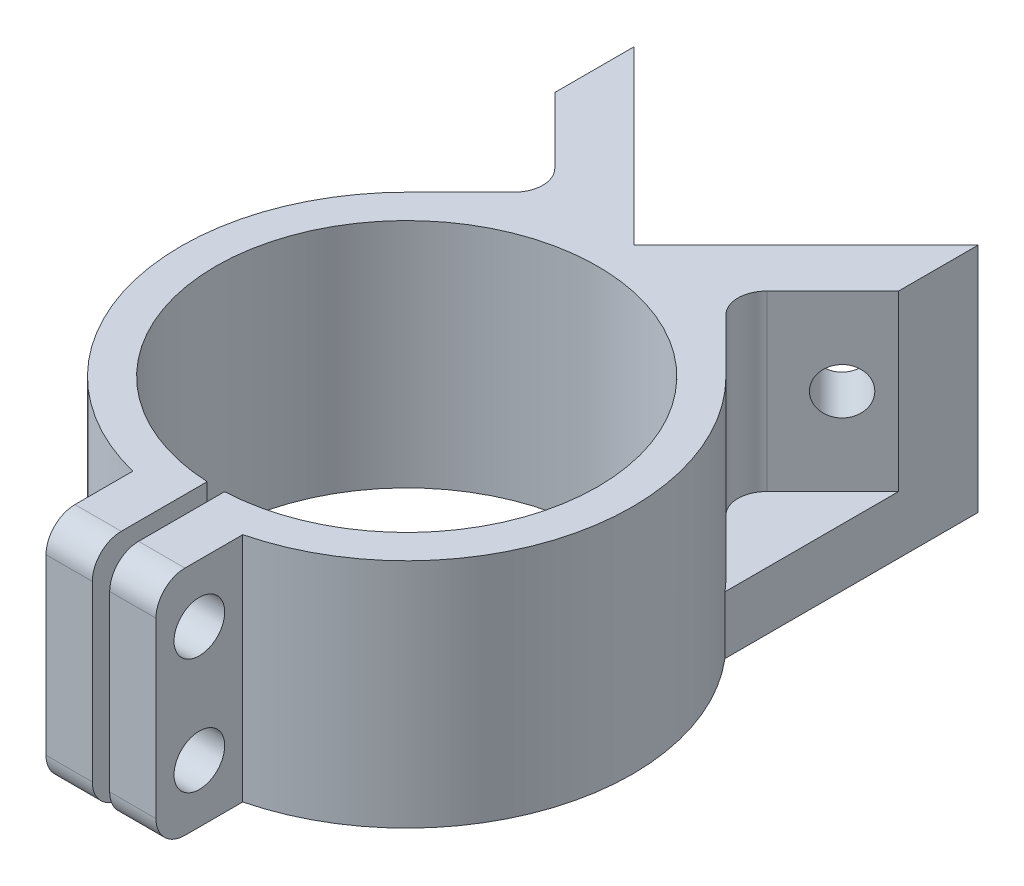
ISO-10303-21;
HEADER;
FILE_DESCRIPTION(('STEP AP214'),'2;1');
FILE_NAME('part.step','',(''),(''),'','','');
FILE_SCHEMA(('AUTOMOTIVE_DESIGN { 1 0 10303 214 1 1 1 1 }'));
ENDSEC;
DATA;
#1=APPLICATION_CONTEXT('core data for automotive mechanical design processes');
#2=APPLICATION_PROTOCOL_DEFINITION('international standard','automotive_design',2000,#1);
#3=PRODUCT_CONTEXT('',#1,'mechanical');
#4=PRODUCT('Part','Part','',(#3));
#5=PRODUCT_RELATED_PRODUCT_CATEGORY('part','',(#4));
#6=PRODUCT_DEFINITION_FORMATION('','',#4);
#7=PRODUCT_DEFINITION_CONTEXT('part definition',#1,'design');
#8=PRODUCT_DEFINITION('design','',#6,#7);
#9=PRODUCT_DEFINITION_SHAPE('','',#8);
#10=(LENGTH_UNIT() NAMED_UNIT(*) SI_UNIT(.MILLI.,.METRE.));
#11=(NAMED_UNIT(*) PLANE_ANGLE_UNIT() SI_UNIT($,.RADIAN.));
#12=(NAMED_UNIT(*) SI_UNIT($,.STERADIAN.) SOLID_ANGLE_UNIT());
#13=UNCERTAINTY_MEASURE_WITH_UNIT(LENGTH_MEASURE(1.E-05),#10,'distance_accuracy_value','');
#14=(GEOMETRIC_REPRESENTATION_CONTEXT(3) GLOBAL_UNCERTAINTY_ASSIGNED_CONTEXT((#13)) GLOBAL_UNIT_ASSIGNED_CONTEXT((#10,
#11,#12)) REPRESENTATION_CONTEXT('',''));
#15=CARTESIAN_POINT('',(0.,0.,0.));
#16=DIRECTION('',(0.,0.,1.));
#17=DIRECTION('',(1.,0.,0.));
#18=AXIS2_PLACEMENT_3D('',#15,#16,#17);
#19=CARTESIAN_POINT('',(1.50000000000001,40.,0.));
#20=DIRECTION('',(1.,0.,0.));
#21=DIRECTION('',(0.,0.,-1.));
#22=AXIS2_PLACEMENT_3D('',#19,#20,#21);
#23=PLANE('',#22);
#24=CARTESIAN_POINT('',(1.50000000000002,30.,45.3205737882841));
#25=DIRECTION('',(1.,0.,0.));
#26=DIRECTION('',(0.,0.,-1.));
#27=AXIS2_PLACEMENT_3D('',#24,#25,#26);
#28=CIRCLE('',#27,4.37500000000001);
#29=CARTESIAN_POINT('',(1.50000000000001,30.,40.9455737882841));
#30=VERTEX_POINT('',#29);
#31=EDGE_CURVE('E286',#30,#30,#28,.F.);
#32=ORIENTED_EDGE('',*,*,#31,.F.);
#33=EDGE_LOOP('',(#32));
#34=FACE_BOUND('',#33,.T.);
#35=DIRECTION('',(0.,0.,1.));
#36=VECTOR('',#35,1.);
#37=CARTESIAN_POINT('',(1.50000000000001,0.,0.));
#38=LINE('',#37,#36);
#39=CARTESIAN_POINT('',(1.50000000000001,0.,32.9658914637539));
#40=VERTEX_POINT('',#39);
#41=CARTESIAN_POINT('',(1.50000000000001,0.,47.8158914637539));
#42=VERTEX_POINT('',#41);
#43=EDGE_CURVE('E323',#40,#42,#38,.T.);
#44=ORIENTED_EDGE('',*,*,#43,.T.);
#45=CARTESIAN_POINT('',(1.50000000000001,5.,47.8158914637539));
#46=DIRECTION('',(1.,0.,0.));
#47=DIRECTION('',(0.,0.,-1.));
#48=AXIS2_PLACEMENT_3D('',#45,#46,#47);
#49=CIRCLE('',#48,5.);
#50=CARTESIAN_POINT('',(1.50000000000002,5.,52.8158914637539));
#51=VERTEX_POINT('',#50);
#52=EDGE_CURVE('E375',#42,#51,#49,.F.);
#53=ORIENTED_EDGE('',*,*,#52,.T.);
#54=DIRECTION('',(0.,-1.,0.));
#55=VECTOR('',#54,1.);
#56=CARTESIAN_POINT('',(1.50000000000002,40.,52.8158914637539));
#57=LINE('',#56,#55);
#58=CARTESIAN_POINT('',(1.50000000000002,35.,52.8158914637539));
#59=VERTEX_POINT('',#58);
#60=EDGE_CURVE('E347',#59,#51,#57,.T.);
#61=ORIENTED_EDGE('',*,*,#60,.F.);
#62=CARTESIAN_POINT('',(1.50000000000001,35.,47.8158914637539));
#63=DIRECTION('',(1.,0.,0.));
#64=DIRECTION('',(0.,0.,-1.));
#65=AXIS2_PLACEMENT_3D('',#62,#63,#64);
#66=CIRCLE('',#65,5.);
#67=CARTESIAN_POINT('',(1.50000000000001,40.,47.8158914637539));
#68=VERTEX_POINT('',#67);
#69=EDGE_CURVE('E50',#59,#68,#66,.F.);
#70=ORIENTED_EDGE('',*,*,#69,.T.);
#71=DIRECTION('',(0.,0.,1.));
#72=VECTOR('',#71,1.);
#73=CARTESIAN_POINT('',(1.50000000000001,40.,0.));
#74=LINE('',#73,#72);
#75=CARTESIAN_POINT('',(1.50000000000001,40.,32.9658914637539));
#76=VERTEX_POINT('',#75);
#77=EDGE_CURVE('E214',#76,#68,#74,.T.);
#78=ORIENTED_EDGE('',*,*,#77,.F.);
#79=DIRECTION('',(0.,-1.,0.));
#80=VECTOR('',#79,1.);
#81=CARTESIAN_POINT('',(1.50000000000001,40.,32.9658914637539));
#82=LINE('',#81,#80);
#83=EDGE_CURVE('E212',#76,#40,#82,.T.);
#84=ORIENTED_EDGE('',*,*,#83,.T.);
#85=EDGE_LOOP('',(#44,#53,#61,#70,#78,#84));
#86=FACE_BOUND('',#85,.T.);
#87=CARTESIAN_POINT('',(1.50000000000002,10.,45.3205737882841));
#88=DIRECTION('',(1.,0.,0.));
#89=DIRECTION('',(0.,0.,-1.));
#90=AXIS2_PLACEMENT_3D('',#87,#88,#89);
#91=CIRCLE('',#90,4.375);
#92=CARTESIAN_POINT('',(1.50000000000001,10.,40.9455737882841));
#93=VERTEX_POINT('',#92);
#94=EDGE_CURVE('E282',#93,#93,#91,.F.);
#95=ORIENTED_EDGE('',*,*,#94,.F.);
#96=EDGE_LOOP('',(#95));
#97=FACE_BOUND('',#96,.T.);
#98=ADVANCED_FACE('F35',(#34,#86,#97),#23,.F.);
#99=CARTESIAN_POINT('',(9.50000000000002,40.,0.));
#100=DIRECTION('',(-1.,0.,0.));
#101=DIRECTION('',(0.,0.,1.));
#102=AXIS2_PLACEMENT_3D('',#99,#100,#101);
#103=PLANE('',#102);
#104=CARTESIAN_POINT('',(9.50000000000002,30.,45.3205737882841));
#105=DIRECTION('',(-1.,0.,0.));
#106=DIRECTION('',(0.,0.,1.));
#107=AXIS2_PLACEMENT_3D('',#104,#105,#106);
#108=CIRCLE('',#107,4.37500000000001);
#109=CARTESIAN_POINT('',(9.50000000000002,30.,49.6955737882841));
#110=VERTEX_POINT('',#109);
#111=EDGE_CURVE('E285',#110,#110,#108,.F.);
#112=ORIENTED_EDGE('',*,*,#111,.F.);
#113=EDGE_LOOP('',(#112));
#114=FACE_BOUND('',#113,.T.);
#115=DIRECTION('',(0.,-1.,0.));
#116=VECTOR('',#115,1.);
#117=CARTESIAN_POINT('',(9.50000000000002,40.,52.8158914637539));
#118=LINE('',#117,#116);
#119=CARTESIAN_POINT('',(9.50000000000002,35.,52.8158914637539));
#120=VERTEX_POINT('',#119);
#121=CARTESIAN_POINT('',(9.50000000000002,5.,52.8158914637539));
#122=VERTEX_POINT('',#121);
#123=EDGE_CURVE('E344',#120,#122,#118,.T.);
#124=ORIENTED_EDGE('',*,*,#123,.T.);
#125=CARTESIAN_POINT('',(9.50000000000002,5.,47.8158914637539));
#126=DIRECTION('',(-1.,0.,0.));
#127=DIRECTION('',(0.,0.,1.));
#128=AXIS2_PLACEMENT_3D('',#125,#126,#127);
#129=CIRCLE('',#128,5.);
#130=CARTESIAN_POINT('',(9.50000000000002,0.,47.8158914637539));
#131=VERTEX_POINT('',#130);
#132=EDGE_CURVE('E371',#122,#131,#129,.F.);
#133=ORIENTED_EDGE('',*,*,#132,.T.);
#134=DIRECTION('',(0.,0.,-1.));
#135=VECTOR('',#134,1.);
#136=CARTESIAN_POINT('',(9.50000000000002,0.,0.));
#137=LINE('',#136,#135);
#138=CARTESIAN_POINT('',(9.50000000000002,0.,37.8252561128144));
#139=VERTEX_POINT('',#138);
#140=EDGE_CURVE('E325',#131,#139,#137,.T.);
#141=ORIENTED_EDGE('',*,*,#140,.T.);
#142=DIRECTION('',(0.,-1.,0.));
#143=VECTOR('',#142,1.);
#144=CARTESIAN_POINT('',(9.50000000000002,40.,37.8252561128144));
#145=LINE('',#144,#143);
#146=CARTESIAN_POINT('',(9.50000000000002,40.,37.8252561128144));
#147=VERTEX_POINT('',#146);
#148=EDGE_CURVE('E341',#147,#139,#145,.T.);
#149=ORIENTED_EDGE('',*,*,#148,.F.);
#150=DIRECTION('',(0.,0.,-1.));
#151=VECTOR('',#150,1.);
#152=CARTESIAN_POINT('',(9.50000000000002,40.,0.));
#153=LINE('',#152,#151);
#154=CARTESIAN_POINT('',(9.50000000000002,40.,47.8158914637539));
#155=VERTEX_POINT('',#154);
#156=EDGE_CURVE('E308',#155,#147,#153,.T.);
#157=ORIENTED_EDGE('',*,*,#156,.F.);
#158=CARTESIAN_POINT('',(9.50000000000002,35.,47.8158914637539));
#159=DIRECTION('',(-1.,0.,0.));
#160=DIRECTION('',(0.,0.,1.));
#161=AXIS2_PLACEMENT_3D('',#158,#159,#160);
#162=CIRCLE('',#161,5.);
#163=EDGE_CURVE('E369',#155,#120,#162,.F.);
#164=ORIENTED_EDGE('',*,*,#163,.T.);
#165=EDGE_LOOP('',(#124,#133,#141,#149,#157,#164));
#166=FACE_BOUND('',#165,.T.);
#167=CARTESIAN_POINT('',(9.50000000000002,10.,45.3205737882841));
#168=DIRECTION('',(-1.,0.,0.));
#169=DIRECTION('',(0.,0.,1.));
#170=AXIS2_PLACEMENT_3D('',#167,#168,#169);
#171=CIRCLE('',#170,4.375);
#172=CARTESIAN_POINT('',(9.50000000000002,10.,49.6955737882841));
#173=VERTEX_POINT('',#172);
#174=EDGE_CURVE('E281',#173,#173,#171,.F.);
#175=ORIENTED_EDGE('',*,*,#174,.F.);
#176=EDGE_LOOP('',(#175));
#177=FACE_BOUND('',#176,.T.);
#178=ADVANCED_FACE('F382',(#114,#166,#177),#103,.F.);
#179=CARTESIAN_POINT('',(0.,40.,0.));
#180=DIRECTION('',(0.,-1.,0.));
#181=DIRECTION('',(0.,0.,-1.));
#182=AXIS2_PLACEMENT_3D('',#179,#180,#181);
#183=CYLINDRICAL_SURFACE('',#182,39.);
#184=DIRECTION('',(0.,-1.,0.));
#185=VECTOR('',#184,1.);
#186=CARTESIAN_POINT('',(29.7000000000004,10.,-25.2766690843548));
#187=LINE('',#186,#185);
#188=CARTESIAN_POINT('',(29.7000000000004,9.99999999999999,-25.2766690843548));
#189=VERTEX_POINT('',#188);
#190=CARTESIAN_POINT('',(29.7000000000004,0.,-25.2766690843548));
#191=VERTEX_POINT('',#190);
#192=EDGE_CURVE('E303',#189,#191,#187,.T.);
#193=ORIENTED_EDGE('',*,*,#192,.F.);
#194=CARTESIAN_POINT('',(0.,10.,0.));
#195=DIRECTION('',(0.,1.,0.));
#196=DIRECTION('',(0.,0.,1.));
#197=AXIS2_PLACEMENT_3D('',#194,#195,#196);
#198=CIRCLE('',#197,39.);
#199=CARTESIAN_POINT('',(27.5771644662753,9.99999999999999,-27.5771644662754));
#200=VERTEX_POINT('',#199);
#201=EDGE_CURVE('E293',#189,#200,#198,.T.);
#202=ORIENTED_EDGE('',*,*,#201,.T.);
#203=DIRECTION('',(0.,-1.,0.));
#204=VECTOR('',#203,1.);
#205=CARTESIAN_POINT('',(27.5771644662753,40.,-27.5771644662754));
#206=LINE('',#205,#204);
#207=CARTESIAN_POINT('',(27.5771644662753,40.,-27.5771644662754));
#208=VERTEX_POINT('',#207);
#209=EDGE_CURVE('E338',#208,#200,#206,.T.);
#210=ORIENTED_EDGE('',*,*,#209,.F.);
#211=CARTESIAN_POINT('',(0.,40.,0.));
#212=DIRECTION('',(0.,1.,0.));
#213=DIRECTION('',(0.,0.,1.));
#214=AXIS2_PLACEMENT_3D('',#211,#212,#213);
#215=CIRCLE('',#214,39.);
#216=EDGE_CURVE('E310',#147,#208,#215,.T.);
#217=ORIENTED_EDGE('',*,*,#216,.F.);
#218=ORIENTED_EDGE('',*,*,#148,.T.);
#219=CARTESIAN_POINT('',(0.,0.,0.));
#220=DIRECTION('',(0.,1.,0.));
#221=DIRECTION('',(0.,0.,1.));
#222=AXIS2_PLACEMENT_3D('',#219,#220,#221);
#223=CIRCLE('',#222,39.);
#224=EDGE_CURVE('E327',#139,#191,#223,.T.);
#225=ORIENTED_EDGE('',*,*,#224,.T.);
#226=EDGE_LOOP('',(#193,#202,#210,#217,#218,#225));
#227=FACE_BOUND('',#226,.T.);
#228=ADVANCED_FACE('F389',(#227),#183,.T.);
#229=CARTESIAN_POINT('',(0.,40.,0.));
#230=DIRECTION('',(0.,-1.,0.));
#231=DIRECTION('',(0.,0.,-1.));
#232=AXIS2_PLACEMENT_3D('',#229,#230,#231);
#233=CYLINDRICAL_SURFACE('',#232,33.);
#234=CARTESIAN_POINT('',(0.,0.,0.));
#235=DIRECTION('',(0.,1.,0.));
#236=DIRECTION('',(0.,0.,1.));
#237=AXIS2_PLACEMENT_3D('',#234,#235,#236);
#238=CIRCLE('',#237,33.);
#239=CARTESIAN_POINT('',(-1.50000000000001,0.,32.9658914637539));
#240=VERTEX_POINT('',#239);
#241=EDGE_CURVE('E305',#240,#40,#238,.F.);
#242=ORIENTED_EDGE('',*,*,#241,.T.);
#243=ORIENTED_EDGE('',*,*,#83,.F.);
#244=CARTESIAN_POINT('',(0.,40.,0.));
#245=DIRECTION('',(0.,1.,0.));
#246=DIRECTION('',(0.,0.,1.));
#247=AXIS2_PLACEMENT_3D('',#244,#245,#246);
#248=CIRCLE('',#247,33.);
#249=CARTESIAN_POINT('',(-1.50000000000001,40.,32.9658914637539));
#250=VERTEX_POINT('',#249);
#251=EDGE_CURVE('E205',#250,#76,#248,.F.);
#252=ORIENTED_EDGE('',*,*,#251,.F.);
#253=DIRECTION('',(0.,-1.,0.));
#254=VECTOR('',#253,1.);
#255=CARTESIAN_POINT('',(-1.50000000000001,40.,32.9658914637539));
#256=LINE('',#255,#254);
#257=EDGE_CURVE('E209',#250,#240,#256,.T.);
#258=ORIENTED_EDGE('',*,*,#257,.T.);
#259=EDGE_LOOP('',(#242,#243,#252,#258));
#260=FACE_BOUND('',#259,.T.);
#261=ADVANCED_FACE('F207',(#260),#233,.F.);
#262=CARTESIAN_POINT('',(0.,40.,52.8158914637539));
#263=DIRECTION('',(0.,0.,-1.));
#264=DIRECTION('',(-1.,0.,0.));
#265=AXIS2_PLACEMENT_3D('',#262,#263,#264);
#266=PLANE('',#265);
#267=ORIENTED_EDGE('',*,*,#60,.T.);
#268=DIRECTION('',(1.,0.,0.));
#269=VECTOR('',#268,1.);
#270=CARTESIAN_POINT('',(0.,5.,52.8158914637539));
#271=LINE('',#270,#269);
#272=EDGE_CURVE('E366',#51,#122,#271,.T.);
#273=ORIENTED_EDGE('',*,*,#272,.T.);
#274=ORIENTED_EDGE('',*,*,#123,.F.);
#275=DIRECTION('',(1.,0.,0.));
#276=VECTOR('',#275,1.);
#277=CARTESIAN_POINT('',(1.50000000000002,35.,52.8158914637539));
#278=LINE('',#277,#276);
#279=EDGE_CURVE('E364',#120,#59,#278,.F.);
#280=ORIENTED_EDGE('',*,*,#279,.T.);
#281=EDGE_LOOP('',(#267,#273,#274,#280));
#282=FACE_BOUND('',#281,.T.);
#283=ADVANCED_FACE('F542',(#282),#266,.F.);
#284=CARTESIAN_POINT('',(27.5771644662753,40.,-27.5771644662754));
#285=DIRECTION('',(-0.707106781186546,0.,0.707106781186549));
#286=DIRECTION('',(0.707106781186549,0.,0.707106781186546));
#287=AXIS2_PLACEMENT_3D('',#284,#285,#286);
#288=PLANE('',#287);
#289=DIRECTION('',(-0.707106781186549,0.,-0.707106781186546));
#290=VECTOR('',#289,1.);
#291=CARTESIAN_POINT('',(27.5771644662753,10.,-27.5771644662754));
#292=LINE('',#291,#290);
#293=CARTESIAN_POINT('',(18.3216341497176,10.,-36.8326947828331));
#294=VERTEX_POINT('',#293);
#295=EDGE_CURVE('E300',#200,#294,#292,.T.);
#296=ORIENTED_EDGE('',*,*,#295,.T.);
#297=DIRECTION('',(0.,-1.,0.));
#298=VECTOR('',#297,1.);
#299=CARTESIAN_POINT('',(18.3216341497176,40.,-36.8326947828331));
#300=LINE('',#299,#298);
#301=CARTESIAN_POINT('',(18.3216341497176,40.,-36.8326947828331));
#302=VERTEX_POINT('',#301);
#303=EDGE_CURVE('E362',#294,#302,#300,.F.);
#304=ORIENTED_EDGE('',*,*,#303,.T.);
#305=DIRECTION('',(-0.707106781186549,0.,-0.707106781186546));
#306=VECTOR('',#305,1.);
#307=CARTESIAN_POINT('',(27.5771644662753,40.,-27.5771644662754));
#308=LINE('',#307,#306);
#309=EDGE_CURVE('E312',#208,#302,#308,.T.);
#310=ORIENTED_EDGE('',*,*,#309,.F.);
#311=ORIENTED_EDGE('',*,*,#209,.T.);
#312=EDGE_LOOP('',(#296,#304,#310,#311));
#313=FACE_BOUND('',#312,.T.);
#314=ADVANCED_FACE('F559',(#313),#288,.F.);
#315=CARTESIAN_POINT('',(-12.7910642224905,40.,-12.7910642224904));
#316=DIRECTION('',(-0.707106781186549,0.,-0.707106781186546));
#317=DIRECTION('',(-0.707106781186546,0.,0.707106781186549));
#318=AXIS2_PLACEMENT_3D('',#315,#316,#317);
#319=PLANE('',#318);
#320=CARTESIAN_POINT('',(24.8194480196478,25.,-50.4015764646288));
#321=DIRECTION('',(0.707106781186549,0.,0.707106781186546));
#322=DIRECTION('',(0.707106781186546,0.,-0.707106781186549));
#323=AXIS2_PLACEMENT_3D('',#320,#321,#322);
#324=CIRCLE('',#323,3.99999999999999);
#325=CARTESIAN_POINT('',(27.647875144394,25.,-53.230003589375));
#326=VERTEX_POINT('',#325);
#327=EDGE_CURVE('E289',#326,#326,#324,.T.);
#328=ORIENTED_EDGE('',*,*,#327,.F.);
#329=EDGE_LOOP('',(#328));
#330=FACE_BOUND('',#329,.T.);
#331=DIRECTION('',(0.707106781186546,0.,-0.707106781186549));
#332=VECTOR('',#331,1.);
#333=CARTESIAN_POINT('',(-12.7910642224905,40.,-12.7910642224904));
#334=LINE('',#333,#332);
#335=CARTESIAN_POINT('',(18.3216341497176,40.,-43.9037625946986));
#336=VERTEX_POINT('',#335);
#337=CARTESIAN_POINT('',(29.7000000000002,40.,-55.2821284449813));
#338=VERTEX_POINT('',#337);
#339=EDGE_CURVE('E315',#336,#338,#334,.T.);
#340=ORIENTED_EDGE('',*,*,#339,.F.);
#341=DIRECTION('',(0.,-1.,0.));
#342=VECTOR('',#341,1.);
#343=CARTESIAN_POINT('',(18.3216341497176,9.99999999999999,-43.9037625946986));
#344=LINE('',#343,#342);
#345=CARTESIAN_POINT('',(18.3216341497176,10.,-43.9037625946986));
#346=VERTEX_POINT('',#345);
#347=EDGE_CURVE('E351',#336,#346,#344,.T.);
#348=ORIENTED_EDGE('',*,*,#347,.T.);
#349=DIRECTION('',(0.707106781186546,0.,-0.707106781186549));
#350=VECTOR('',#349,1.);
#351=CARTESIAN_POINT('',(-12.7910642224905,10.,-12.7910642224904));
#352=LINE('',#351,#350);
#353=CARTESIAN_POINT('',(29.7000000000002,9.99999999999999,-55.2821284449813));
#354=VERTEX_POINT('',#353);
#355=EDGE_CURVE('E298',#346,#354,#352,.T.);
#356=ORIENTED_EDGE('',*,*,#355,.T.);
#357=DIRECTION('',(0.,-1.,0.));
#358=VECTOR('',#357,1.);
#359=CARTESIAN_POINT('',(29.7000000000002,40.,-55.2821284449813));
#360=LINE('',#359,#358);
#361=EDGE_CURVE('E335',#338,#354,#360,.T.);
#362=ORIENTED_EDGE('',*,*,#361,.F.);
#363=EDGE_LOOP('',(#340,#348,#356,#362));
#364=FACE_BOUND('',#363,.T.);
#365=ADVANCED_FACE('F400',(#330,#364),#319,.F.);
#366=CARTESIAN_POINT('',(29.7000000000002,40.,0.));
#367=DIRECTION('',(-1.,0.,0.));
#368=DIRECTION('',(0.,0.,1.));
#369=AXIS2_PLACEMENT_3D('',#366,#367,#368);
#370=PLANE('',#369);
#371=DIRECTION('',(0.,0.,-1.));
#372=VECTOR('',#371,1.);
#373=CARTESIAN_POINT('',(29.7000000000002,0.,0.));
#374=LINE('',#373,#372);
#375=CARTESIAN_POINT('',(29.7000000000002,0.,-69.0000000000003));
#376=VERTEX_POINT('',#375);
#377=EDGE_CURVE('E330',#191,#376,#374,.T.);
#378=ORIENTED_EDGE('',*,*,#377,.T.);
#379=DIRECTION('',(0.,-1.,0.));
#380=VECTOR('',#379,1.);
#381=CARTESIAN_POINT('',(29.7000000000002,40.,-69.0000000000003));
#382=LINE('',#381,#380);
#383=CARTESIAN_POINT('',(29.7000000000002,40.,-69.0000000000003));
#384=VERTEX_POINT('',#383);
#385=EDGE_CURVE('E321',#384,#376,#382,.T.);
#386=ORIENTED_EDGE('',*,*,#385,.F.);
#387=DIRECTION('',(0.,0.,-1.));
#388=VECTOR('',#387,1.);
#389=CARTESIAN_POINT('',(29.7000000000002,40.,0.));
#390=LINE('',#389,#388);
#391=EDGE_CURVE('E317',#338,#384,#390,.T.);
#392=ORIENTED_EDGE('',*,*,#391,.F.);
#393=ORIENTED_EDGE('',*,*,#361,.T.);
#394=DIRECTION('',(0.,0.,-1.));
#395=VECTOR('',#394,1.);
#396=CARTESIAN_POINT('',(29.7000000000005,10.,-1.8887701494259E-13));
#397=LINE('',#396,#395);
#398=EDGE_CURVE('E295',#189,#354,#397,.T.);
#399=ORIENTED_EDGE('',*,*,#398,.F.);
#400=ORIENTED_EDGE('',*,*,#192,.T.);
#401=EDGE_LOOP('',(#378,#386,#392,#393,#399,#400));
#402=FACE_BOUND('',#401,.T.);
#403=ADVANCED_FACE('F408',(#402),#370,.F.);
#404=CARTESIAN_POINT('',(-19.65,40.,-19.6499999999999));
#405=DIRECTION('',(0.707106781186549,0.,0.707106781186546));
#406=DIRECTION('',(0.707106781186546,0.,-0.707106781186549));
#407=AXIS2_PLACEMENT_3D('',#404,#405,#406);
#408=PLANE('',#407);
#409=CARTESIAN_POINT('',(17.9605122421383,25.,-57.2605122421383));
#410=DIRECTION('',(0.707106781186549,0.,0.707106781186546));
#411=DIRECTION('',(0.707106781186546,0.,-0.707106781186549));
#412=AXIS2_PLACEMENT_3D('',#409,#410,#411);
#413=CIRCLE('',#412,3.99999999999999);
#414=CARTESIAN_POINT('',(20.7889393668845,25.,-60.0889393668845));
#415=VERTEX_POINT('',#414);
#416=EDGE_CURVE('E292',#415,#415,#413,.T.);
#417=ORIENTED_EDGE('',*,*,#416,.T.);
#418=EDGE_LOOP('',(#417));
#419=FACE_BOUND('',#418,.T.);
#420=DIRECTION('',(-0.707106781186546,0.,0.707106781186549));
#421=VECTOR('',#420,1.);
#422=CARTESIAN_POINT('',(-19.65,0.,-19.6499999999999));
#423=LINE('',#422,#421);
#424=CARTESIAN_POINT('',(0.,0.,-39.3));
#425=VERTEX_POINT('',#424);
#426=EDGE_CURVE('E215',#376,#425,#423,.T.);
#427=ORIENTED_EDGE('',*,*,#426,.T.);
#428=DIRECTION('',(0.,-1.,0.));
#429=VECTOR('',#428,1.);
#430=CARTESIAN_POINT('',(0.,40.,-39.3));
#431=LINE('',#430,#429);
#432=CARTESIAN_POINT('',(0.,40.,-39.3));
#433=VERTEX_POINT('',#432);
#434=EDGE_CURVE('E418',#433,#425,#431,.T.);
#435=ORIENTED_EDGE('',*,*,#434,.F.);
#436=DIRECTION('',(-0.707106781186546,0.,0.707106781186549));
#437=VECTOR('',#436,1.);
#438=CARTESIAN_POINT('',(-19.65,40.,-19.6499999999999));
#439=LINE('',#438,#437);
#440=EDGE_CURVE('E319',#384,#433,#439,.T.);
#441=ORIENTED_EDGE('',*,*,#440,.F.);
#442=ORIENTED_EDGE('',*,*,#385,.T.);
#443=EDGE_LOOP('',(#427,#435,#441,#442));
#444=FACE_BOUND('',#443,.T.);
#445=ADVANCED_FACE('F419',(#419,#444),#408,.F.);
#446=CARTESIAN_POINT('',(0.,40.,0.));
#447=DIRECTION('',(0.,1.,0.));
#448=DIRECTION('',(0.,0.,1.));
#449=AXIS2_PLACEMENT_3D('',#446,#447,#448);
#450=PLANE('',#449);
#451=ORIENTED_EDGE('',*,*,#77,.T.);
#452=DIRECTION('',(1.,0.,0.));
#453=VECTOR('',#452,1.);
#454=CARTESIAN_POINT('',(9.50000000000002,40.,47.8158914637539));
#455=LINE('',#454,#453);
#456=EDGE_CURVE('E43',#68,#155,#455,.T.);
#457=ORIENTED_EDGE('',*,*,#456,.T.);
#458=ORIENTED_EDGE('',*,*,#156,.T.);
#459=ORIENTED_EDGE('',*,*,#216,.T.);
#460=ORIENTED_EDGE('',*,*,#309,.T.);
#461=CARTESIAN_POINT('',(21.8571680556503,40.,-40.3682286887658));
#462=DIRECTION('',(0.,1.,0.));
#463=DIRECTION('',(0.,0.,1.));
#464=AXIS2_PLACEMENT_3D('',#461,#462,#463);
#465=CIRCLE('',#464,5.);
#466=EDGE_CURVE('E11',#302,#336,#465,.F.);
#467=ORIENTED_EDGE('',*,*,#466,.T.);
#468=ORIENTED_EDGE('',*,*,#339,.T.);
#469=ORIENTED_EDGE('',*,*,#391,.T.);
#470=ORIENTED_EDGE('',*,*,#440,.T.);
#471=DIRECTION('',(0.707106781186546,0.,0.707106781186549));
#472=VECTOR('',#471,1.);
#473=CARTESIAN_POINT('',(19.65,40.,-19.6499999999999));
#474=LINE('',#473,#472);
#475=CARTESIAN_POINT('',(-29.7000000000002,40.,-69.0000000000003));
#476=VERTEX_POINT('',#475);
#477=EDGE_CURVE('E414',#476,#433,#474,.T.);
#478=ORIENTED_EDGE('',*,*,#477,.F.);
#479=DIRECTION('',(0.,0.,-1.));
#480=VECTOR('',#479,1.);
#481=CARTESIAN_POINT('',(-29.7000000000002,40.,0.));
#482=LINE('',#481,#480);
#483=CARTESIAN_POINT('',(-29.7000000000002,40.,-55.2821284449813));
#484=VERTEX_POINT('',#483);
#485=EDGE_CURVE('E428',#484,#476,#482,.T.);
#486=ORIENTED_EDGE('',*,*,#485,.F.);
#487=DIRECTION('',(-0.707106781186546,0.,-0.707106781186549));
#488=VECTOR('',#487,1.);
#489=CARTESIAN_POINT('',(12.7910642224905,40.,-12.7910642224904));
#490=LINE('',#489,#488);
#491=CARTESIAN_POINT('',(-18.3216341497176,40.,-43.9037625946986));
#492=VERTEX_POINT('',#491);
#493=EDGE_CURVE('E430',#492,#484,#490,.T.);
#494=ORIENTED_EDGE('',*,*,#493,.F.);
#495=CARTESIAN_POINT('',(-21.8571680556503,40.,-40.3682286887658));
#496=DIRECTION('',(0.,-1.,0.));
#497=DIRECTION('',(0.,0.,1.));
#498=AXIS2_PLACEMENT_3D('',#495,#496,#497);
#499=CIRCLE('',#498,5.);
#500=CARTESIAN_POINT('',(-18.3216341497176,40.,-36.8326947828331));
#501=VERTEX_POINT('',#500);
#502=EDGE_CURVE('E279',#501,#492,#499,.F.);
#503=ORIENTED_EDGE('',*,*,#502,.F.);
#504=DIRECTION('',(0.707106781186549,0.,-0.707106781186546));
#505=VECTOR('',#504,1.);
#506=CARTESIAN_POINT('',(-27.5771644662753,40.,-27.5771644662754));
#507=LINE('',#506,#505);
#508=CARTESIAN_POINT('',(-27.5771644662753,40.,-27.5771644662754));
#509=VERTEX_POINT('',#508);
#510=EDGE_CURVE('E475',#509,#501,#507,.T.);
#511=ORIENTED_EDGE('',*,*,#510,.F.);
#512=CARTESIAN_POINT('',(0.,40.,0.));
#513=DIRECTION('',(0.,-1.,0.));
#514=DIRECTION('',(0.,0.,1.));
#515=AXIS2_PLACEMENT_3D('',#512,#513,#514);
#516=CIRCLE('',#515,39.);
#517=CARTESIAN_POINT('',(-9.50000000000002,40.,37.8252561128144));
#518=VERTEX_POINT('',#517);
#519=EDGE_CURVE('E472',#518,#509,#516,.T.);
#520=ORIENTED_EDGE('',*,*,#519,.F.);
#521=DIRECTION('',(0.,0.,-1.));
#522=VECTOR('',#521,1.);
#523=CARTESIAN_POINT('',(-9.50000000000002,40.,0.));
#524=LINE('',#523,#522);
#525=CARTESIAN_POINT('',(-9.50000000000002,40.,47.8158914637539));
#526=VERTEX_POINT('',#525);
#527=EDGE_CURVE('E225',#526,#518,#524,.T.);
#528=ORIENTED_EDGE('',*,*,#527,.F.);
#529=DIRECTION('',(-1.,0.,0.));
#530=VECTOR('',#529,1.);
#531=CARTESIAN_POINT('',(-9.50000000000002,40.,47.8158914637539));
#532=LINE('',#531,#530);
#533=CARTESIAN_POINT('',(-1.50000000000001,40.,47.8158914637539));
#534=VERTEX_POINT('',#533);
#535=EDGE_CURVE('E221',#534,#526,#532,.T.);
#536=ORIENTED_EDGE('',*,*,#535,.F.);
#537=DIRECTION('',(0.,0.,1.));
#538=VECTOR('',#537,1.);
#539=CARTESIAN_POINT('',(-1.50000000000001,40.,0.));
#540=LINE('',#539,#538);
#541=EDGE_CURVE('E218',#250,#534,#540,.T.);
#542=ORIENTED_EDGE('',*,*,#541,.F.);
#543=ORIENTED_EDGE('',*,*,#251,.T.);
#544=EDGE_LOOP('',(#451,#457,#458,#459,#460,#467,#468,#469,#470,#478,#486,#494,#503,#511,#520,
#528,#536,#542,#543));
#545=FACE_BOUND('',#544,.T.);
#546=ADVANCED_FACE('F219',(#545),#450,.T.);
#547=CARTESIAN_POINT('',(0.,0.,0.));
#548=DIRECTION('',(0.,1.,0.));
#549=DIRECTION('',(0.,0.,1.));
#550=AXIS2_PLACEMENT_3D('',#547,#548,#549);
#551=PLANE('',#550);
#552=ORIENTED_EDGE('',*,*,#140,.F.);
#553=DIRECTION('',(1.,0.,0.));
#554=VECTOR('',#553,1.);
#555=CARTESIAN_POINT('',(0.,0.,47.8158914637539));
#556=LINE('',#555,#554);
#557=EDGE_CURVE('E58',#131,#42,#556,.F.);
#558=ORIENTED_EDGE('',*,*,#557,.T.);
#559=ORIENTED_EDGE('',*,*,#43,.F.);
#560=ORIENTED_EDGE('',*,*,#241,.F.);
#561=DIRECTION('',(0.,0.,1.));
#562=VECTOR('',#561,1.);
#563=CARTESIAN_POINT('',(-1.50000000000001,0.,0.));
#564=LINE('',#563,#562);
#565=CARTESIAN_POINT('',(-1.50000000000001,0.,47.8158914637539));
#566=VERTEX_POINT('',#565);
#567=EDGE_CURVE('E232',#240,#566,#564,.T.);
#568=ORIENTED_EDGE('',*,*,#567,.T.);
#569=DIRECTION('',(-1.,0.,0.));
#570=VECTOR('',#569,1.);
#571=CARTESIAN_POINT('',(0.,0.,47.8158914637539));
#572=LINE('',#571,#570);
#573=CARTESIAN_POINT('',(-9.50000000000002,0.,47.8158914637539));
#574=VERTEX_POINT('',#573);
#575=EDGE_CURVE('E271',#574,#566,#572,.F.);
#576=ORIENTED_EDGE('',*,*,#575,.F.);
#577=DIRECTION('',(0.,0.,-1.));
#578=VECTOR('',#577,1.);
#579=CARTESIAN_POINT('',(-9.50000000000002,0.,0.));
#580=LINE('',#579,#578);
#581=CARTESIAN_POINT('',(-9.50000000000002,0.,37.8252561128144));
#582=VERTEX_POINT('',#581);
#583=EDGE_CURVE('E435',#574,#582,#580,.T.);
#584=ORIENTED_EDGE('',*,*,#583,.T.);
#585=CARTESIAN_POINT('',(0.,0.,0.));
#586=DIRECTION('',(0.,-1.,0.));
#587=DIRECTION('',(0.,0.,1.));
#588=AXIS2_PLACEMENT_3D('',#585,#586,#587);
#589=CIRCLE('',#588,39.);
#590=CARTESIAN_POINT('',(-29.7000000000004,0.,-25.2766690843548));
#591=VERTEX_POINT('',#590);
#592=EDGE_CURVE('E439',#582,#591,#589,.T.);
#593=ORIENTED_EDGE('',*,*,#592,.T.);
#594=DIRECTION('',(0.,0.,-1.));
#595=VECTOR('',#594,1.);
#596=CARTESIAN_POINT('',(-29.7000000000002,0.,0.));
#597=LINE('',#596,#595);
#598=CARTESIAN_POINT('',(-29.7000000000002,0.,-69.0000000000003));
#599=VERTEX_POINT('',#598);
#600=EDGE_CURVE('E442',#591,#599,#597,.T.);
#601=ORIENTED_EDGE('',*,*,#600,.T.);
#602=DIRECTION('',(0.707106781186546,0.,0.707106781186549));
#603=VECTOR('',#602,1.);
#604=CARTESIAN_POINT('',(19.65,0.,-19.6499999999999));
#605=LINE('',#604,#603);
#606=EDGE_CURVE('E226',#599,#425,#605,.T.);
#607=ORIENTED_EDGE('',*,*,#606,.T.);
#608=ORIENTED_EDGE('',*,*,#426,.F.);
#609=ORIENTED_EDGE('',*,*,#377,.F.);
#610=ORIENTED_EDGE('',*,*,#224,.F.);
#611=EDGE_LOOP('',(#552,#558,#559,#560,#568,#576,#584,#593,#601,#607,#608,#609,#610));
#612=FACE_BOUND('',#611,.T.);
#613=ADVANCED_FACE('F558',(#612),#551,.F.);
#614=CARTESIAN_POINT('',(0.,10.,0.));
#615=DIRECTION('',(0.,1.,0.));
#616=DIRECTION('',(0.,0.,1.));
#617=AXIS2_PLACEMENT_3D('',#614,#615,#616);
#618=PLANE('',#617);
#619=ORIENTED_EDGE('',*,*,#355,.F.);
#620=CARTESIAN_POINT('',(21.8571680556503,9.99999999999999,-40.3682286887658));
#621=DIRECTION('',(0.,1.,0.));
#622=DIRECTION('',(0.,0.,1.));
#623=AXIS2_PLACEMENT_3D('',#620,#621,#622);
#624=CIRCLE('',#623,5.);
#625=EDGE_CURVE('E360',#346,#294,#624,.T.);
#626=ORIENTED_EDGE('',*,*,#625,.T.);
#627=ORIENTED_EDGE('',*,*,#295,.F.);
#628=ORIENTED_EDGE('',*,*,#201,.F.);
#629=ORIENTED_EDGE('',*,*,#398,.T.);
#630=EDGE_LOOP('',(#619,#626,#627,#628,#629));
#631=FACE_BOUND('',#630,.T.);
#632=ADVANCED_FACE('F403',(#631),#618,.T.);
#633=CARTESIAN_POINT('',(3.11051224213812,25.,-72.1105122421384));
#634=DIRECTION('',(0.707106781186549,0.,0.707106781186546));
#635=DIRECTION('',(0.707106781186546,0.,-0.707106781186549));
#636=AXIS2_PLACEMENT_3D('',#633,#634,#635);
#637=CYLINDRICAL_SURFACE('',#636,3.99999999999999);
#638=ORIENTED_EDGE('',*,*,#327,.T.);
#639=EDGE_LOOP('',(#638));
#640=FACE_BOUND('',#639,.T.);
#641=ORIENTED_EDGE('',*,*,#416,.F.);
#642=EDGE_LOOP('',(#641));
#643=FACE_BOUND('',#642,.T.);
#644=ADVANCED_FACE('F605',(#640,#643),#637,.F.);
#645=CARTESIAN_POINT('',(10.,30.,45.3205737882841));
#646=DIRECTION('',(-1.,0.,0.));
#647=DIRECTION('',(0.,0.,1.));
#648=AXIS2_PLACEMENT_3D('',#645,#646,#647);
#649=CYLINDRICAL_SURFACE('',#648,4.37500000000001);
#650=ORIENTED_EDGE('',*,*,#111,.T.);
#651=EDGE_LOOP('',(#650));
#652=FACE_BOUND('',#651,.T.);
#653=ORIENTED_EDGE('',*,*,#31,.T.);
#654=EDGE_LOOP('',(#653));
#655=FACE_BOUND('',#654,.T.);
#656=ADVANCED_FACE('F614',(#652,#655),#649,.F.);
#657=CARTESIAN_POINT('',(10.,10.,45.3205737882841));
#658=DIRECTION('',(-1.,0.,0.));
#659=DIRECTION('',(0.,0.,1.));
#660=AXIS2_PLACEMENT_3D('',#657,#658,#659);
#661=CYLINDRICAL_SURFACE('',#660,4.375);
#662=ORIENTED_EDGE('',*,*,#174,.T.);
#663=EDGE_LOOP('',(#662));
#664=FACE_BOUND('',#663,.T.);
#665=ORIENTED_EDGE('',*,*,#94,.T.);
#666=EDGE_LOOP('',(#665));
#667=FACE_BOUND('',#666,.T.);
#668=ADVANCED_FACE('F547',(#664,#667),#661,.F.);
#669=CARTESIAN_POINT('',(21.8571680556503,40.,-40.3682286887658));
#670=DIRECTION('',(0.,1.,0.));
#671=DIRECTION('',(0.,0.,1.));
#672=AXIS2_PLACEMENT_3D('',#669,#670,#671);
#673=CYLINDRICAL_SURFACE('',#672,5.);
#674=ORIENTED_EDGE('',*,*,#466,.F.);
#675=ORIENTED_EDGE('',*,*,#303,.F.);
#676=ORIENTED_EDGE('',*,*,#625,.F.);
#677=ORIENTED_EDGE('',*,*,#347,.F.);
#678=EDGE_LOOP('',(#674,#675,#676,#677));
#679=FACE_BOUND('',#678,.T.);
#680=ADVANCED_FACE('F397',(#679),#673,.F.);
#681=CARTESIAN_POINT('',(0.,5.,47.8158914637539));
#682=DIRECTION('',(1.,0.,0.));
#683=DIRECTION('',(0.,0.,-1.));
#684=AXIS2_PLACEMENT_3D('',#681,#682,#683);
#685=CYLINDRICAL_SURFACE('',#684,5.);
#686=ORIENTED_EDGE('',*,*,#52,.F.);
#687=ORIENTED_EDGE('',*,*,#557,.F.);
#688=ORIENTED_EDGE('',*,*,#132,.F.);
#689=ORIENTED_EDGE('',*,*,#272,.F.);
#690=EDGE_LOOP('',(#686,#687,#688,#689));
#691=FACE_BOUND('',#690,.T.);
#692=ADVANCED_FACE('F546',(#691),#685,.T.);
#693=CARTESIAN_POINT('',(0.,35.,47.8158914637539));
#694=DIRECTION('',(-1.,0.,0.));
#695=DIRECTION('',(0.,0.,1.));
#696=AXIS2_PLACEMENT_3D('',#693,#694,#695);
#697=CYLINDRICAL_SURFACE('',#696,5.);
#698=ORIENTED_EDGE('',*,*,#69,.F.);
#699=ORIENTED_EDGE('',*,*,#279,.F.);
#700=ORIENTED_EDGE('',*,*,#163,.F.);
#701=ORIENTED_EDGE('',*,*,#456,.F.);
#702=EDGE_LOOP('',(#698,#699,#700,#701));
#703=FACE_BOUND('',#702,.T.);
#704=ADVANCED_FACE('F37',(#703),#697,.T.);
#705=CARTESIAN_POINT('',(-1.50000000000001,40.,0.));
#706=DIRECTION('',(-1.,0.,0.));
#707=DIRECTION('',(0.,0.,-1.));
#708=AXIS2_PLACEMENT_3D('',#705,#706,#707);
#709=PLANE('',#708);
#710=CARTESIAN_POINT('',(-1.50000000000002,30.,45.3205737882841));
#711=DIRECTION('',(1.,0.,0.));
#712=DIRECTION('',(0.,0.,-1.));
#713=AXIS2_PLACEMENT_3D('',#710,#711,#712);
#714=CIRCLE('',#713,4.37500000000001);
#715=CARTESIAN_POINT('',(-1.50000000000001,30.,40.9455737882841));
#716=VERTEX_POINT('',#715);
#717=EDGE_CURVE('E252',#716,#716,#714,.F.);
#718=ORIENTED_EDGE('',*,*,#717,.T.);
#719=EDGE_LOOP('',(#718));
#720=FACE_BOUND('',#719,.T.);
#721=ORIENTED_EDGE('',*,*,#567,.F.);
#722=ORIENTED_EDGE('',*,*,#257,.F.);
#723=ORIENTED_EDGE('',*,*,#541,.T.);
#724=CARTESIAN_POINT('',(-1.50000000000001,35.,47.8158914637539));
#725=DIRECTION('',(1.,0.,0.));
#726=DIRECTION('',(0.,0.,-1.));
#727=AXIS2_PLACEMENT_3D('',#724,#725,#726);
#728=CIRCLE('',#727,5.);
#729=CARTESIAN_POINT('',(-1.50000000000002,35.,52.8158914637539));
#730=VERTEX_POINT('',#729);
#731=EDGE_CURVE('E273',#730,#534,#728,.F.);
#732=ORIENTED_EDGE('',*,*,#731,.F.);
#733=DIRECTION('',(0.,-1.,0.));
#734=VECTOR('',#733,1.);
#735=CARTESIAN_POINT('',(-1.50000000000002,40.,52.8158914637539));
#736=LINE('',#735,#734);
#737=CARTESIAN_POINT('',(-1.50000000000002,5.,52.8158914637539));
#738=VERTEX_POINT('',#737);
#739=EDGE_CURVE('E234',#730,#738,#736,.T.);
#740=ORIENTED_EDGE('',*,*,#739,.T.);
#741=CARTESIAN_POINT('',(-1.50000000000001,5.,47.8158914637539));
#742=DIRECTION('',(1.,0.,0.));
#743=DIRECTION('',(0.,0.,-1.));
#744=AXIS2_PLACEMENT_3D('',#741,#742,#743);
#745=CIRCLE('',#744,5.);
#746=EDGE_CURVE('E275',#566,#738,#745,.F.);
#747=ORIENTED_EDGE('',*,*,#746,.F.);
#748=EDGE_LOOP('',(#721,#722,#723,#732,#740,#747));
#749=FACE_BOUND('',#748,.T.);
#750=CARTESIAN_POINT('',(-1.50000000000002,10.,45.3205737882841));
#751=DIRECTION('',(1.,0.,0.));
#752=DIRECTION('',(0.,0.,-1.));
#753=AXIS2_PLACEMENT_3D('',#750,#751,#752);
#754=CIRCLE('',#753,4.375);
#755=CARTESIAN_POINT('',(-1.50000000000001,10.,40.9455737882841));
#756=VERTEX_POINT('',#755);
#757=EDGE_CURVE('E253',#756,#756,#754,.F.);
#758=ORIENTED_EDGE('',*,*,#757,.T.);
#759=EDGE_LOOP('',(#758));
#760=FACE_BOUND('',#759,.T.);
#761=ADVANCED_FACE('F228',(#720,#749,#760),#709,.F.);
#762=CARTESIAN_POINT('',(-9.50000000000002,40.,0.));
#763=DIRECTION('',(1.,0.,0.));
#764=DIRECTION('',(0.,0.,1.));
#765=AXIS2_PLACEMENT_3D('',#762,#763,#764);
#766=PLANE('',#765);
#767=CARTESIAN_POINT('',(-9.50000000000002,30.,45.3205737882841));
#768=DIRECTION('',(-1.,0.,0.));
#769=DIRECTION('',(0.,0.,1.));
#770=AXIS2_PLACEMENT_3D('',#767,#768,#769);
#771=CIRCLE('',#770,4.37500000000001);
#772=CARTESIAN_POINT('',(-9.50000000000002,30.,49.6955737882841));
#773=VERTEX_POINT('',#772);
#774=EDGE_CURVE('E249',#773,#773,#771,.F.);
#775=ORIENTED_EDGE('',*,*,#774,.T.);
#776=EDGE_LOOP('',(#775));
#777=FACE_BOUND('',#776,.T.);
#778=DIRECTION('',(0.,-1.,0.));
#779=VECTOR('',#778,1.);
#780=CARTESIAN_POINT('',(-9.50000000000002,40.,52.8158914637539));
#781=LINE('',#780,#779);
#782=CARTESIAN_POINT('',(-9.50000000000002,35.,52.8158914637539));
#783=VERTEX_POINT('',#782);
#784=CARTESIAN_POINT('',(-9.50000000000002,5.,52.8158914637539));
#785=VERTEX_POINT('',#784);
#786=EDGE_CURVE('E240',#783,#785,#781,.T.);
#787=ORIENTED_EDGE('',*,*,#786,.F.);
#788=CARTESIAN_POINT('',(-9.50000000000002,35.,47.8158914637539));
#789=DIRECTION('',(-1.,0.,0.));
#790=DIRECTION('',(0.,0.,1.));
#791=AXIS2_PLACEMENT_3D('',#788,#789,#790);
#792=CIRCLE('',#791,5.);
#793=EDGE_CURVE('E265',#526,#783,#792,.F.);
#794=ORIENTED_EDGE('',*,*,#793,.F.);
#795=ORIENTED_EDGE('',*,*,#527,.T.);
#796=DIRECTION('',(0.,-1.,0.));
#797=VECTOR('',#796,1.);
#798=CARTESIAN_POINT('',(-9.50000000000002,40.,37.8252561128144));
#799=LINE('',#798,#797);
#800=EDGE_CURVE('E453',#518,#582,#799,.T.);
#801=ORIENTED_EDGE('',*,*,#800,.T.);
#802=ORIENTED_EDGE('',*,*,#583,.F.);
#803=CARTESIAN_POINT('',(-9.50000000000002,5.,47.8158914637539));
#804=DIRECTION('',(-1.,0.,0.));
#805=DIRECTION('',(0.,0.,1.));
#806=AXIS2_PLACEMENT_3D('',#803,#804,#805);
#807=CIRCLE('',#806,5.);
#808=EDGE_CURVE('E268',#785,#574,#807,.F.);
#809=ORIENTED_EDGE('',*,*,#808,.F.);
#810=EDGE_LOOP('',(#787,#794,#795,#801,#802,#809));
#811=FACE_BOUND('',#810,.T.);
#812=CARTESIAN_POINT('',(-9.50000000000002,10.,45.3205737882841));
#813=DIRECTION('',(-1.,0.,0.));
#814=DIRECTION('',(0.,0.,1.));
#815=AXIS2_PLACEMENT_3D('',#812,#813,#814);
#816=CIRCLE('',#815,4.375);
#817=CARTESIAN_POINT('',(-9.50000000000002,10.,49.6955737882841));
#818=VERTEX_POINT('',#817);
#819=EDGE_CURVE('E254',#818,#818,#816,.F.);
#820=ORIENTED_EDGE('',*,*,#819,.T.);
#821=EDGE_LOOP('',(#820));
#822=FACE_BOUND('',#821,.T.);
#823=ADVANCED_FACE('F463',(#777,#811,#822),#766,.F.);
#824=CARTESIAN_POINT('',(0.,40.,0.));
#825=DIRECTION('',(0.,-1.,0.));
#826=DIRECTION('',(0.,0.,-1.));
#827=AXIS2_PLACEMENT_3D('',#824,#825,#826);
#828=CYLINDRICAL_SURFACE('',#827,39.);
#829=DIRECTION('',(0.,-1.,0.));
#830=VECTOR('',#829,1.);
#831=CARTESIAN_POINT('',(-29.7000000000004,10.,-25.2766690843548));
#832=LINE('',#831,#830);
#833=CARTESIAN_POINT('',(-29.7000000000004,9.99999999999999,-25.2766690843548));
#834=VERTEX_POINT('',#833);
#835=EDGE_CURVE('E436',#834,#591,#832,.T.);
#836=ORIENTED_EDGE('',*,*,#835,.T.);
#837=ORIENTED_EDGE('',*,*,#592,.F.);
#838=ORIENTED_EDGE('',*,*,#800,.F.);
#839=ORIENTED_EDGE('',*,*,#519,.T.);
#840=DIRECTION('',(0.,-1.,0.));
#841=VECTOR('',#840,1.);
#842=CARTESIAN_POINT('',(-27.5771644662753,40.,-27.5771644662754));
#843=LINE('',#842,#841);
#844=CARTESIAN_POINT('',(-27.5771644662753,9.99999999999999,-27.5771644662754));
#845=VERTEX_POINT('',#844);
#846=EDGE_CURVE('E450',#509,#845,#843,.T.);
#847=ORIENTED_EDGE('',*,*,#846,.T.);
#848=CARTESIAN_POINT('',(0.,10.,0.));
#849=DIRECTION('',(0.,-1.,0.));
#850=DIRECTION('',(0.,0.,1.));
#851=AXIS2_PLACEMENT_3D('',#848,#849,#850);
#852=CIRCLE('',#851,39.);
#853=EDGE_CURVE('E247',#834,#845,#852,.T.);
#854=ORIENTED_EDGE('',*,*,#853,.F.);
#855=EDGE_LOOP('',(#836,#837,#838,#839,#847,#854));
#856=FACE_BOUND('',#855,.T.);
#857=ADVANCED_FACE('F505',(#856),#828,.T.);
#858=CARTESIAN_POINT('',(0.,40.,52.8158914637539));
#859=DIRECTION('',(0.,0.,-1.));
#860=DIRECTION('',(1.,0.,0.));
#861=AXIS2_PLACEMENT_3D('',#858,#859,#860);
#862=PLANE('',#861);
#863=ORIENTED_EDGE('',*,*,#739,.F.);
#864=DIRECTION('',(-1.,0.,0.));
#865=VECTOR('',#864,1.);
#866=CARTESIAN_POINT('',(-1.50000000000002,35.,52.8158914637539));
#867=LINE('',#866,#865);
#868=EDGE_CURVE('E261',#783,#730,#867,.F.);
#869=ORIENTED_EDGE('',*,*,#868,.F.);
#870=ORIENTED_EDGE('',*,*,#786,.T.);
#871=DIRECTION('',(-1.,0.,0.));
#872=VECTOR('',#871,1.);
#873=CARTESIAN_POINT('',(0.,5.,52.8158914637539));
#874=LINE('',#873,#872);
#875=EDGE_CURVE('E263',#738,#785,#874,.T.);
#876=ORIENTED_EDGE('',*,*,#875,.F.);
#877=EDGE_LOOP('',(#863,#869,#870,#876));
#878=FACE_BOUND('',#877,.T.);
#879=ADVANCED_FACE('F459',(#878),#862,.F.);
#880=CARTESIAN_POINT('',(-27.5771644662753,40.,-27.5771644662754));
#881=DIRECTION('',(0.707106781186546,0.,0.707106781186549));
#882=DIRECTION('',(-0.707106781186549,0.,0.707106781186546));
#883=AXIS2_PLACEMENT_3D('',#880,#881,#882);
#884=PLANE('',#883);
#885=DIRECTION('',(0.707106781186549,0.,-0.707106781186546));
#886=VECTOR('',#885,1.);
#887=CARTESIAN_POINT('',(-27.5771644662753,10.,-27.5771644662754));
#888=LINE('',#887,#886);
#889=CARTESIAN_POINT('',(-18.3216341497176,10.,-36.8326947828331));
#890=VERTEX_POINT('',#889);
#891=EDGE_CURVE('E500',#845,#890,#888,.T.);
#892=ORIENTED_EDGE('',*,*,#891,.F.);
#893=ORIENTED_EDGE('',*,*,#846,.F.);
#894=ORIENTED_EDGE('',*,*,#510,.T.);
#895=DIRECTION('',(0.,-1.,0.));
#896=VECTOR('',#895,1.);
#897=CARTESIAN_POINT('',(-18.3216341497176,40.,-36.8326947828331));
#898=LINE('',#897,#896);
#899=EDGE_CURVE('E258',#890,#501,#898,.F.);
#900=ORIENTED_EDGE('',*,*,#899,.F.);
#901=EDGE_LOOP('',(#892,#893,#894,#900));
#902=FACE_BOUND('',#901,.T.);
#903=ADVANCED_FACE('F699',(#902),#884,.F.);
#904=CARTESIAN_POINT('',(12.7910642224905,40.,-12.7910642224904));
#905=DIRECTION('',(0.707106781186549,0.,-0.707106781186546));
#906=DIRECTION('',(0.707106781186546,0.,0.707106781186549));
#907=AXIS2_PLACEMENT_3D('',#904,#905,#906);
#908=PLANE('',#907);
#909=CARTESIAN_POINT('',(-24.8194480196478,25.,-50.4015764646288));
#910=DIRECTION('',(0.707106781186549,0.,-0.707106781186546));
#911=DIRECTION('',(-0.707106781186546,0.,-0.707106781186549));
#912=AXIS2_PLACEMENT_3D('',#909,#910,#911);
#913=CIRCLE('',#912,3.99999999999999);
#914=CARTESIAN_POINT('',(-27.647875144394,25.,-53.230003589375));
#915=VERTEX_POINT('',#914);
#916=EDGE_CURVE('E248',#915,#915,#913,.T.);
#917=ORIENTED_EDGE('',*,*,#916,.T.);
#918=EDGE_LOOP('',(#917));
#919=FACE_BOUND('',#918,.T.);
#920=ORIENTED_EDGE('',*,*,#493,.T.);
#921=DIRECTION('',(0.,-1.,0.));
#922=VECTOR('',#921,1.);
#923=CARTESIAN_POINT('',(-29.7000000000002,40.,-55.2821284449813));
#924=LINE('',#923,#922);
#925=CARTESIAN_POINT('',(-29.7000000000002,9.99999999999999,-55.2821284449813));
#926=VERTEX_POINT('',#925);
#927=EDGE_CURVE('E447',#484,#926,#924,.T.);
#928=ORIENTED_EDGE('',*,*,#927,.T.);
#929=DIRECTION('',(-0.707106781186546,0.,-0.707106781186549));
#930=VECTOR('',#929,1.);
#931=CARTESIAN_POINT('',(12.7910642224905,10.,-12.7910642224904));
#932=LINE('',#931,#930);
#933=CARTESIAN_POINT('',(-18.3216341497176,10.,-43.9037625946986));
#934=VERTEX_POINT('',#933);
#935=EDGE_CURVE('E496',#934,#926,#932,.T.);
#936=ORIENTED_EDGE('',*,*,#935,.F.);
#937=DIRECTION('',(0.,-1.,0.));
#938=VECTOR('',#937,1.);
#939=CARTESIAN_POINT('',(-18.3216341497176,9.99999999999999,-43.9037625946986));
#940=LINE('',#939,#938);
#941=EDGE_CURVE('E233',#492,#934,#940,.T.);
#942=ORIENTED_EDGE('',*,*,#941,.F.);
#943=EDGE_LOOP('',(#920,#928,#936,#942));
#944=FACE_BOUND('',#943,.T.);
#945=ADVANCED_FACE('F484',(#919,#944),#908,.F.);
#946=CARTESIAN_POINT('',(-29.7000000000002,40.,0.));
#947=DIRECTION('',(1.,0.,0.));
#948=DIRECTION('',(0.,0.,1.));
#949=AXIS2_PLACEMENT_3D('',#946,#947,#948);
#950=PLANE('',#949);
#951=ORIENTED_EDGE('',*,*,#600,.F.);
#952=ORIENTED_EDGE('',*,*,#835,.F.);
#953=DIRECTION('',(0.,0.,-1.));
#954=VECTOR('',#953,1.);
#955=CARTESIAN_POINT('',(-29.7000000000005,10.,-1.8887701494259E-13));
#956=LINE('',#955,#954);
#957=EDGE_CURVE('E490',#834,#926,#956,.T.);
#958=ORIENTED_EDGE('',*,*,#957,.T.);
#959=ORIENTED_EDGE('',*,*,#927,.F.);
#960=ORIENTED_EDGE('',*,*,#485,.T.);
#961=DIRECTION('',(0.,-1.,0.));
#962=VECTOR('',#961,1.);
#963=CARTESIAN_POINT('',(-29.7000000000002,40.,-69.0000000000003));
#964=LINE('',#963,#962);
#965=EDGE_CURVE('E423',#476,#599,#964,.T.);
#966=ORIENTED_EDGE('',*,*,#965,.T.);
#967=EDGE_LOOP('',(#951,#952,#958,#959,#960,#966));
#968=FACE_BOUND('',#967,.T.);
#969=ADVANCED_FACE('F488',(#968),#950,.F.);
#970=CARTESIAN_POINT('',(19.65,40.,-19.6499999999999));
#971=DIRECTION('',(-0.707106781186549,0.,0.707106781186546));
#972=DIRECTION('',(-0.707106781186546,0.,-0.707106781186549));
#973=AXIS2_PLACEMENT_3D('',#970,#971,#972);
#974=PLANE('',#973);
#975=CARTESIAN_POINT('',(-17.9605122421383,25.,-57.2605122421383));
#976=DIRECTION('',(0.707106781186549,0.,-0.707106781186546));
#977=DIRECTION('',(-0.707106781186546,0.,-0.707106781186549));
#978=AXIS2_PLACEMENT_3D('',#975,#976,#977);
#979=CIRCLE('',#978,3.99999999999999);
#980=CARTESIAN_POINT('',(-20.7889393668845,25.,-60.0889393668845));
#981=VERTEX_POINT('',#980);
#982=EDGE_CURVE('E244',#981,#981,#979,.T.);
#983=ORIENTED_EDGE('',*,*,#982,.F.);
#984=EDGE_LOOP('',(#983));
#985=FACE_BOUND('',#984,.T.);
#986=ORIENTED_EDGE('',*,*,#606,.F.);
#987=ORIENTED_EDGE('',*,*,#965,.F.);
#988=ORIENTED_EDGE('',*,*,#477,.T.);
#989=ORIENTED_EDGE('',*,*,#434,.T.);
#990=EDGE_LOOP('',(#986,#987,#988,#989));
#991=FACE_BOUND('',#990,.T.);
#992=ADVANCED_FACE('F425',(#985,#991),#974,.F.);
#993=CARTESIAN_POINT('',(0.,10.,0.));
#994=DIRECTION('',(0.,1.,0.));
#995=DIRECTION('',(0.,0.,1.));
#996=AXIS2_PLACEMENT_3D('',#993,#994,#995);
#997=PLANE('',#996);
#998=ORIENTED_EDGE('',*,*,#935,.T.);
#999=ORIENTED_EDGE('',*,*,#957,.F.);
#1000=ORIENTED_EDGE('',*,*,#853,.T.);
#1001=ORIENTED_EDGE('',*,*,#891,.T.);
#1002=CARTESIAN_POINT('',(-21.8571680556503,9.99999999999999,-40.3682286887658));
#1003=DIRECTION('',(0.,-1.,0.));
#1004=DIRECTION('',(0.,0.,1.));
#1005=AXIS2_PLACEMENT_3D('',#1002,#1003,#1004);
#1006=CIRCLE('',#1005,5.);
#1007=EDGE_CURVE('E237',#934,#890,#1006,.T.);
#1008=ORIENTED_EDGE('',*,*,#1007,.F.);
#1009=EDGE_LOOP('',(#998,#999,#1000,#1001,#1008));
#1010=FACE_BOUND('',#1009,.T.);
#1011=ADVANCED_FACE('F498',(#1010),#997,.T.);
#1012=CARTESIAN_POINT('',(-3.11051224213812,25.,-72.1105122421384));
#1013=DIRECTION('',(-0.707106781186549,0.,0.707106781186546));
#1014=DIRECTION('',(-0.707106781186546,0.,-0.707106781186549));
#1015=AXIS2_PLACEMENT_3D('',#1012,#1013,#1014);
#1016=CYLINDRICAL_SURFACE('',#1015,3.99999999999999);
#1017=ORIENTED_EDGE('',*,*,#916,.F.);
#1018=EDGE_LOOP('',(#1017));
#1019=FACE_BOUND('',#1018,.T.);
#1020=ORIENTED_EDGE('',*,*,#982,.T.);
#1021=EDGE_LOOP('',(#1020));
#1022=FACE_BOUND('',#1021,.T.);
#1023=ADVANCED_FACE('F527',(#1019,#1022),#1016,.F.);
#1024=CARTESIAN_POINT('',(-10.,30.,45.3205737882841));
#1025=DIRECTION('',(1.,0.,0.));
#1026=DIRECTION('',(0.,0.,1.));
#1027=AXIS2_PLACEMENT_3D('',#1024,#1025,#1026);
#1028=CYLINDRICAL_SURFACE('',#1027,4.37500000000001);
#1029=ORIENTED_EDGE('',*,*,#774,.F.);
#1030=EDGE_LOOP('',(#1029));
#1031=FACE_BOUND('',#1030,.T.);
#1032=ORIENTED_EDGE('',*,*,#717,.F.);
#1033=EDGE_LOOP('',(#1032));
#1034=FACE_BOUND('',#1033,.T.);
#1035=ADVANCED_FACE('F518',(#1031,#1034),#1028,.F.);
#1036=CARTESIAN_POINT('',(-10.,10.,45.3205737882841));
#1037=DIRECTION('',(1.,0.,0.));
#1038=DIRECTION('',(0.,0.,1.));
#1039=AXIS2_PLACEMENT_3D('',#1036,#1037,#1038);
#1040=CYLINDRICAL_SURFACE('',#1039,4.375);
#1041=ORIENTED_EDGE('',*,*,#819,.F.);
#1042=EDGE_LOOP('',(#1041));
#1043=FACE_BOUND('',#1042,.T.);
#1044=ORIENTED_EDGE('',*,*,#757,.F.);
#1045=EDGE_LOOP('',(#1044));
#1046=FACE_BOUND('',#1045,.T.);
#1047=ADVANCED_FACE('F515',(#1043,#1046),#1040,.F.);
#1048=CARTESIAN_POINT('',(-21.8571680556503,40.,-40.3682286887658));
#1049=DIRECTION('',(0.,1.,0.));
#1050=DIRECTION('',(0.,0.,1.));
#1051=AXIS2_PLACEMENT_3D('',#1048,#1049,#1050);
#1052=CYLINDRICAL_SURFACE('',#1051,5.);
#1053=ORIENTED_EDGE('',*,*,#502,.T.);
#1054=ORIENTED_EDGE('',*,*,#941,.T.);
#1055=ORIENTED_EDGE('',*,*,#1007,.T.);
#1056=ORIENTED_EDGE('',*,*,#899,.T.);
#1057=EDGE_LOOP('',(#1053,#1054,#1055,#1056));
#1058=FACE_BOUND('',#1057,.T.);
#1059=ADVANCED_FACE('F517',(#1058),#1052,.F.);
#1060=CARTESIAN_POINT('',(0.,5.,47.8158914637539));
#1061=DIRECTION('',(-1.,0.,0.));
#1062=DIRECTION('',(0.,0.,-1.));
#1063=AXIS2_PLACEMENT_3D('',#1060,#1061,#1062);
#1064=CYLINDRICAL_SURFACE('',#1063,5.);
#1065=ORIENTED_EDGE('',*,*,#746,.T.);
#1066=ORIENTED_EDGE('',*,*,#875,.T.);
#1067=ORIENTED_EDGE('',*,*,#808,.T.);
#1068=ORIENTED_EDGE('',*,*,#575,.T.);
#1069=EDGE_LOOP('',(#1065,#1066,#1067,#1068));
#1070=FACE_BOUND('',#1069,.T.);
#1071=ADVANCED_FACE('F468',(#1070),#1064,.T.);
#1072=CARTESIAN_POINT('',(0.,35.,47.8158914637539));
#1073=DIRECTION('',(1.,0.,0.));
#1074=DIRECTION('',(0.,0.,1.));
#1075=AXIS2_PLACEMENT_3D('',#1072,#1073,#1074);
#1076=CYLINDRICAL_SURFACE('',#1075,5.);
#1077=ORIENTED_EDGE('',*,*,#731,.T.);
#1078=ORIENTED_EDGE('',*,*,#535,.T.);
#1079=ORIENTED_EDGE('',*,*,#793,.T.);
#1080=ORIENTED_EDGE('',*,*,#868,.T.);
#1081=EDGE_LOOP('',(#1077,#1078,#1079,#1080));
#1082=FACE_BOUND('',#1081,.T.);
#1083=ADVANCED_FACE('F470',(#1082),#1076,.T.);
#1084=CLOSED_SHELL('',(#98,#178,#228,#261,#283,#314,#365,#403,#445,#546,#613,#632,#644,#656,
#668,#680,#692,#704,#761,#823,#857,#879,#903,#945,#969,#992,#1011,#1023,#1035,#1047,#1059,#1071,#1083));
#1085=MANIFOLD_SOLID_BREP('B2',#1084);
#1086=ADVANCED_BREP_SHAPE_REPRESENTATION('',(#18,#1085),#14);
#1087=SHAPE_DEFINITION_REPRESENTATION(#9,#1086);
ENDSEC;
END-ISO-10303-21;
